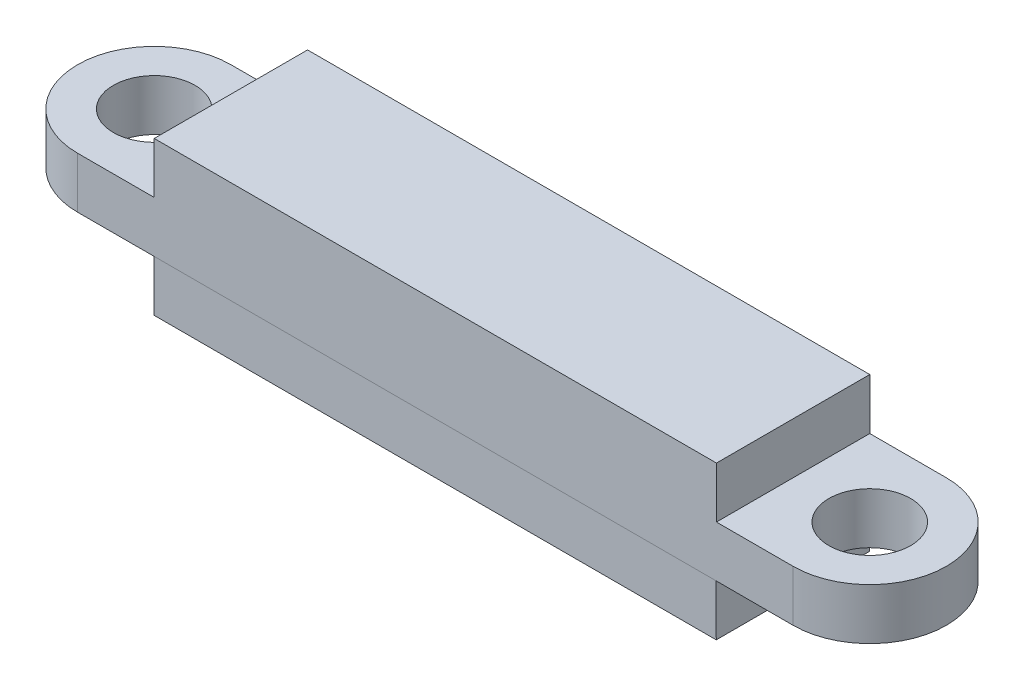
ISO-10303-21;
HEADER;
FILE_DESCRIPTION(('STEP AP214'),'2;1');
FILE_NAME('part.step','',(''),(''),'','','');
FILE_SCHEMA(('AUTOMOTIVE_DESIGN { 1 0 10303 214 1 1 1 1 }'));
ENDSEC;
DATA;
#1=APPLICATION_CONTEXT('core data for automotive mechanical design processes');
#2=APPLICATION_PROTOCOL_DEFINITION('international standard','automotive_design',2000,#1);
#3=PRODUCT_CONTEXT('',#1,'mechanical');
#4=PRODUCT('Part','Part','',(#3));
#5=PRODUCT_RELATED_PRODUCT_CATEGORY('part','',(#4));
#6=PRODUCT_DEFINITION_FORMATION('','',#4);
#7=PRODUCT_DEFINITION_CONTEXT('part definition',#1,'design');
#8=PRODUCT_DEFINITION('design','',#6,#7);
#9=PRODUCT_DEFINITION_SHAPE('','',#8);
#10=(LENGTH_UNIT() NAMED_UNIT(*) SI_UNIT(.MILLI.,.METRE.));
#11=(NAMED_UNIT(*) PLANE_ANGLE_UNIT() SI_UNIT($,.RADIAN.));
#12=(NAMED_UNIT(*) SI_UNIT($,.STERADIAN.) SOLID_ANGLE_UNIT());
#13=UNCERTAINTY_MEASURE_WITH_UNIT(LENGTH_MEASURE(1.E-05),#10,'distance_accuracy_value','');
#14=(GEOMETRIC_REPRESENTATION_CONTEXT(3) GLOBAL_UNCERTAINTY_ASSIGNED_CONTEXT((#13)) GLOBAL_UNIT_ASSIGNED_CONTEXT((#10,
#11,#12)) REPRESENTATION_CONTEXT('',''));
#15=CARTESIAN_POINT('',(0.,0.,0.));
#16=DIRECTION('',(0.,0.,1.));
#17=DIRECTION('',(1.,0.,0.));
#18=AXIS2_PLACEMENT_3D('',#15,#16,#17);
#19=CARTESIAN_POINT('',(35.,0.,0.));
#20=DIRECTION('',(0.,1.,0.));
#21=DIRECTION('',(0.,0.,1.));
#22=AXIS2_PLACEMENT_3D('',#19,#20,#21);
#23=PLANE('',#22);
#24=CARTESIAN_POINT('',(35.,0.,0.));
#25=DIRECTION('',(0.,1.,0.));
#26=DIRECTION('',(0.,0.,1.));
#27=AXIS2_PLACEMENT_3D('',#24,#25,#26);
#28=CIRCLE('',#27,4.);
#29=CARTESIAN_POINT('',(35.,0.,3.99999999999998));
#30=VERTEX_POINT('',#29);
#31=EDGE_CURVE('E330',#30,#30,#28,.T.);
#32=ORIENTED_EDGE('',*,*,#31,.T.);
#33=EDGE_LOOP('',(#32));
#34=FACE_BOUND('',#33,.T.);
#35=DIRECTION('',(0.,0.,1.));
#36=VECTOR('',#35,1.);
#37=CARTESIAN_POINT('',(27.4726856732423,0.,-7.50859596867283));
#38=LINE('',#37,#36);
#39=CARTESIAN_POINT('',(27.4726856732423,0.,-7.50404798433642));
#40=VERTEX_POINT('',#39);
#41=CARTESIAN_POINT('',(27.4726856732423,0.,7.49595201566357));
#42=VERTEX_POINT('',#41);
#43=EDGE_CURVE('E63',#40,#42,#38,.T.);
#44=ORIENTED_EDGE('',*,*,#43,.F.);
#45=DIRECTION('',(1.,0.,0.));
#46=VECTOR('',#45,1.);
#47=CARTESIAN_POINT('',(35.,0.,-7.50000000000001));
#48=LINE('',#47,#46);
#49=CARTESIAN_POINT('',(35.,0.,-7.50000000000001));
#50=VERTEX_POINT('',#49);
#51=EDGE_CURVE('E78',#50,#40,#48,.F.);
#52=ORIENTED_EDGE('',*,*,#51,.F.);
#53=CARTESIAN_POINT('',(35.,0.,0.));
#54=DIRECTION('',(0.,1.,0.));
#55=DIRECTION('',(0.,0.,1.));
#56=AXIS2_PLACEMENT_3D('',#53,#54,#55);
#57=CIRCLE('',#56,7.5);
#58=CARTESIAN_POINT('',(35.,0.,7.49999999999999));
#59=VERTEX_POINT('',#58);
#60=EDGE_CURVE('E246',#59,#50,#57,.T.);
#61=ORIENTED_EDGE('',*,*,#60,.F.);
#62=DIRECTION('',(-1.,0.,0.));
#63=VECTOR('',#62,1.);
#64=CARTESIAN_POINT('',(35.,0.,7.49999999999999));
#65=LINE('',#64,#63);
#66=EDGE_CURVE('E148',#42,#59,#65,.F.);
#67=ORIENTED_EDGE('',*,*,#66,.F.);
#68=EDGE_LOOP('',(#44,#52,#61,#67));
#69=FACE_BOUND('',#68,.T.);
#70=ADVANCED_FACE('F44',(#34,#69),#23,.F.);
#71=CARTESIAN_POINT('',(-35.,0.,0.));
#72=DIRECTION('',(0.,1.,0.));
#73=DIRECTION('',(0.,0.,1.));
#74=AXIS2_PLACEMENT_3D('',#71,#72,#73);
#75=CIRCLE('',#74,4.);
#76=CARTESIAN_POINT('',(-35.,0.,4.00000000000001));
#77=VERTEX_POINT('',#76);
#78=EDGE_CURVE('E331',#77,#77,#75,.T.);
#79=ORIENTED_EDGE('',*,*,#78,.T.);
#80=EDGE_LOOP('',(#79));
#81=FACE_BOUND('',#80,.T.);
#82=DIRECTION('',(0.,0.,-1.));
#83=VECTOR('',#82,1.);
#84=CARTESIAN_POINT('',(-27.5273143267578,0.,-7.50859596867283));
#85=LINE('',#84,#83);
#86=CARTESIAN_POINT('',(-27.5273143267578,0.,7.49595201566357));
#87=VERTEX_POINT('',#86);
#88=CARTESIAN_POINT('',(-27.5273143267578,0.,-7.50404798433641));
#89=VERTEX_POINT('',#88);
#90=EDGE_CURVE('E121',#87,#89,#85,.T.);
#91=ORIENTED_EDGE('',*,*,#90,.F.);
#92=DIRECTION('',(-1.,0.,0.));
#93=VECTOR('',#92,1.);
#94=CARTESIAN_POINT('',(35.,0.,7.49999999999999));
#95=LINE('',#94,#93);
#96=CARTESIAN_POINT('',(-35.,0.,7.50000000000001));
#97=VERTEX_POINT('',#96);
#98=EDGE_CURVE('E129',#97,#87,#95,.F.);
#99=ORIENTED_EDGE('',*,*,#98,.F.);
#100=CARTESIAN_POINT('',(-35.,0.,0.));
#101=DIRECTION('',(0.,1.,0.));
#102=DIRECTION('',(0.,0.,1.));
#103=AXIS2_PLACEMENT_3D('',#100,#101,#102);
#104=CIRCLE('',#103,7.5);
#105=CARTESIAN_POINT('',(-35.,0.,-7.49999999999999));
#106=VERTEX_POINT('',#105);
#107=EDGE_CURVE('E230',#106,#97,#104,.T.);
#108=ORIENTED_EDGE('',*,*,#107,.F.);
#109=DIRECTION('',(1.,0.,0.));
#110=VECTOR('',#109,1.);
#111=CARTESIAN_POINT('',(35.,0.,-7.50000000000001));
#112=LINE('',#111,#110);
#113=EDGE_CURVE('E128',#89,#106,#112,.F.);
#114=ORIENTED_EDGE('',*,*,#113,.F.);
#115=EDGE_LOOP('',(#91,#99,#108,#114));
#116=FACE_BOUND('',#115,.T.);
#117=ADVANCED_FACE('F127',(#81,#116),#23,.F.);
#118=CARTESIAN_POINT('',(35.,5.,0.));
#119=DIRECTION('',(0.,1.,0.));
#120=DIRECTION('',(0.,0.,1.));
#121=AXIS2_PLACEMENT_3D('',#118,#119,#120);
#122=PLANE('',#121);
#123=DIRECTION('',(0.,0.,-1.));
#124=VECTOR('',#123,1.);
#125=CARTESIAN_POINT('',(27.5,5.,7.50000000000008));
#126=LINE('',#125,#124);
#127=CARTESIAN_POINT('',(27.5,5.,7.49999999999999));
#128=VERTEX_POINT('',#127);
#129=CARTESIAN_POINT('',(27.5,5.,-7.50000000000001));
#130=VERTEX_POINT('',#129);
#131=EDGE_CURVE('E298',#128,#130,#126,.T.);
#132=ORIENTED_EDGE('',*,*,#131,.F.);
#133=DIRECTION('',(1.,0.,0.));
#134=VECTOR('',#133,1.);
#135=CARTESIAN_POINT('',(35.,5.,7.49999999999999));
#136=LINE('',#135,#134);
#137=CARTESIAN_POINT('',(35.,5.,7.49999999999999));
#138=VERTEX_POINT('',#137);
#139=EDGE_CURVE('E354',#128,#138,#136,.T.);
#140=ORIENTED_EDGE('',*,*,#139,.T.);
#141=CARTESIAN_POINT('',(35.,5.,0.));
#142=DIRECTION('',(0.,1.,0.));
#143=DIRECTION('',(0.,0.,1.));
#144=AXIS2_PLACEMENT_3D('',#141,#142,#143);
#145=CIRCLE('',#144,7.5);
#146=CARTESIAN_POINT('',(35.,5.,-7.50000000000001));
#147=VERTEX_POINT('',#146);
#148=EDGE_CURVE('E146',#138,#147,#145,.T.);
#149=ORIENTED_EDGE('',*,*,#148,.T.);
#150=DIRECTION('',(-1.,0.,0.));
#151=VECTOR('',#150,1.);
#152=CARTESIAN_POINT('',(35.,5.,-7.50000000000001));
#153=LINE('',#152,#151);
#154=EDGE_CURVE('E350',#147,#130,#153,.T.);
#155=ORIENTED_EDGE('',*,*,#154,.T.);
#156=EDGE_LOOP('',(#132,#140,#149,#155));
#157=FACE_BOUND('',#156,.T.);
#158=CARTESIAN_POINT('',(35.,5.,0.));
#159=DIRECTION('',(0.,1.,0.));
#160=DIRECTION('',(0.,0.,1.));
#161=AXIS2_PLACEMENT_3D('',#158,#159,#160);
#162=CIRCLE('',#161,4.);
#163=CARTESIAN_POINT('',(35.,5.,3.99999999999998));
#164=VERTEX_POINT('',#163);
#165=EDGE_CURVE('E328',#164,#164,#162,.T.);
#166=ORIENTED_EDGE('',*,*,#165,.F.);
#167=EDGE_LOOP('',(#166));
#168=FACE_BOUND('',#167,.T.);
#169=ADVANCED_FACE('F214',(#157,#168),#122,.T.);
#170=DIRECTION('',(0.,0.,1.));
#171=VECTOR('',#170,1.);
#172=CARTESIAN_POINT('',(-27.5,5.,7.49999999999994));
#173=LINE('',#172,#171);
#174=CARTESIAN_POINT('',(-27.5,5.,-7.49999999999999));
#175=VERTEX_POINT('',#174);
#176=CARTESIAN_POINT('',(-27.5,5.,7.49999999999994));
#177=VERTEX_POINT('',#176);
#178=EDGE_CURVE('E161',#175,#177,#173,.T.);
#179=ORIENTED_EDGE('',*,*,#178,.F.);
#180=CARTESIAN_POINT('',(-35.,5.,-7.49999999999999));
#181=VERTEX_POINT('',#180);
#182=EDGE_CURVE('E346',#175,#181,#153,.T.);
#183=ORIENTED_EDGE('',*,*,#182,.T.);
#184=CARTESIAN_POINT('',(-35.,5.,0.));
#185=DIRECTION('',(0.,1.,0.));
#186=DIRECTION('',(0.,0.,1.));
#187=AXIS2_PLACEMENT_3D('',#184,#185,#186);
#188=CIRCLE('',#187,7.5);
#189=CARTESIAN_POINT('',(-35.,5.,7.50000000000001));
#190=VERTEX_POINT('',#189);
#191=EDGE_CURVE('E347',#181,#190,#188,.T.);
#192=ORIENTED_EDGE('',*,*,#191,.T.);
#193=EDGE_CURVE('E227',#190,#177,#136,.T.);
#194=ORIENTED_EDGE('',*,*,#193,.T.);
#195=EDGE_LOOP('',(#179,#183,#192,#194));
#196=FACE_BOUND('',#195,.T.);
#197=CARTESIAN_POINT('',(-35.,5.,0.));
#198=DIRECTION('',(0.,1.,0.));
#199=DIRECTION('',(0.,0.,1.));
#200=AXIS2_PLACEMENT_3D('',#197,#198,#199);
#201=CIRCLE('',#200,4.);
#202=CARTESIAN_POINT('',(-35.,5.,4.00000000000001));
#203=VERTEX_POINT('',#202);
#204=EDGE_CURVE('E337',#203,#203,#201,.T.);
#205=ORIENTED_EDGE('',*,*,#204,.F.);
#206=EDGE_LOOP('',(#205));
#207=FACE_BOUND('',#206,.T.);
#208=ADVANCED_FACE('F208',(#196,#207),#122,.T.);
#209=CARTESIAN_POINT('',(35.,5.,0.));
#210=DIRECTION('',(0.,-1.,0.));
#211=DIRECTION('',(0.,0.,-1.));
#212=AXIS2_PLACEMENT_3D('',#209,#210,#211);
#213=CYLINDRICAL_SURFACE('',#212,7.5);
#214=ORIENTED_EDGE('',*,*,#60,.T.);
#215=DIRECTION('',(0.,-1.,0.));
#216=VECTOR('',#215,1.);
#217=CARTESIAN_POINT('',(35.,5.,-7.50000000000001));
#218=LINE('',#217,#216);
#219=EDGE_CURVE('E11',#147,#50,#218,.T.);
#220=ORIENTED_EDGE('',*,*,#219,.F.);
#221=ORIENTED_EDGE('',*,*,#148,.F.);
#222=DIRECTION('',(0.,-1.,0.));
#223=VECTOR('',#222,1.);
#224=CARTESIAN_POINT('',(35.,5.,7.49999999999999));
#225=LINE('',#224,#223);
#226=EDGE_CURVE('E356',#138,#59,#225,.T.);
#227=ORIENTED_EDGE('',*,*,#226,.T.);
#228=EDGE_LOOP('',(#214,#220,#221,#227));
#229=FACE_BOUND('',#228,.T.);
#230=ADVANCED_FACE('F50',(#229),#213,.T.);
#231=CARTESIAN_POINT('',(35.,5.,-7.50000000000001));
#232=DIRECTION('',(0.,0.,1.));
#233=DIRECTION('',(1.,0.,0.));
#234=AXIS2_PLACEMENT_3D('',#231,#232,#233);
#235=PLANE('',#234);
#236=ORIENTED_EDGE('',*,*,#51,.T.);
#237=CARTESIAN_POINT('',(-27.5273143267578,0.,-7.50859596867283));
#238=DIRECTION('',(1.,0.,0.));
#239=VECTOR('',#238,1.);
#240=LINE('',#237,#239);
#241=EDGE_CURVE('E139',#89,#40,#240,.T.);
#242=ORIENTED_EDGE('',*,*,#241,.F.);
#243=ORIENTED_EDGE('',*,*,#113,.T.);
#244=DIRECTION('',(0.,-1.,0.));
#245=VECTOR('',#244,1.);
#246=CARTESIAN_POINT('',(-35.,5.,-7.49999999999999));
#247=LINE('',#246,#245);
#248=EDGE_CURVE('E57',#181,#106,#247,.T.);
#249=ORIENTED_EDGE('',*,*,#248,.F.);
#250=ORIENTED_EDGE('',*,*,#182,.F.);
#251=DIRECTION('',(0.,-1.,0.));
#252=VECTOR('',#251,1.);
#253=CARTESIAN_POINT('',(-27.5,10.,-7.49999999999999));
#254=LINE('',#253,#252);
#255=CARTESIAN_POINT('',(-27.5,10.,-7.49999999999999));
#256=VERTEX_POINT('',#255);
#257=EDGE_CURVE('E324',#256,#175,#254,.T.);
#258=ORIENTED_EDGE('',*,*,#257,.F.);
#259=DIRECTION('',(-1.,0.,0.));
#260=VECTOR('',#259,1.);
#261=CARTESIAN_POINT('',(-27.5,10.,-7.49999999999999));
#262=LINE('',#261,#260);
#263=CARTESIAN_POINT('',(27.5,10.,-7.50000000000001));
#264=VERTEX_POINT('',#263);
#265=EDGE_CURVE('E292',#264,#256,#262,.T.);
#266=ORIENTED_EDGE('',*,*,#265,.F.);
#267=DIRECTION('',(0.,-1.,0.));
#268=VECTOR('',#267,1.);
#269=CARTESIAN_POINT('',(27.5,10.,-7.50000000000001));
#270=LINE('',#269,#268);
#271=EDGE_CURVE('E304',#264,#130,#270,.T.);
#272=ORIENTED_EDGE('',*,*,#271,.T.);
#273=ORIENTED_EDGE('',*,*,#154,.F.);
#274=ORIENTED_EDGE('',*,*,#219,.T.);
#275=EDGE_LOOP('',(#236,#242,#243,#249,#250,#258,#266,#272,#273,#274));
#276=FACE_BOUND('',#275,.T.);
#277=ADVANCED_FACE('F247',(#276),#235,.F.);
#278=CARTESIAN_POINT('',(-35.,5.,0.));
#279=DIRECTION('',(0.,-1.,0.));
#280=DIRECTION('',(0.,0.,-1.));
#281=AXIS2_PLACEMENT_3D('',#278,#279,#280);
#282=CYLINDRICAL_SURFACE('',#281,7.5);
#283=ORIENTED_EDGE('',*,*,#107,.T.);
#284=DIRECTION('',(0.,-1.,0.));
#285=VECTOR('',#284,1.);
#286=CARTESIAN_POINT('',(-35.,5.,7.50000000000001));
#287=LINE('',#286,#285);
#288=EDGE_CURVE('E150',#190,#97,#287,.T.);
#289=ORIENTED_EDGE('',*,*,#288,.F.);
#290=ORIENTED_EDGE('',*,*,#191,.F.);
#291=ORIENTED_EDGE('',*,*,#248,.T.);
#292=EDGE_LOOP('',(#283,#289,#290,#291));
#293=FACE_BOUND('',#292,.T.);
#294=ADVANCED_FACE('F224',(#293),#282,.T.);
#295=CARTESIAN_POINT('',(35.,5.,7.49999999999999));
#296=DIRECTION('',(0.,0.,-1.));
#297=DIRECTION('',(-1.,0.,0.));
#298=AXIS2_PLACEMENT_3D('',#295,#296,#297);
#299=PLANE('',#298);
#300=ORIENTED_EDGE('',*,*,#98,.T.);
#301=CARTESIAN_POINT('',(27.4726856732423,0.,7.49140403132714));
#302=DIRECTION('',(-1.,0.,0.));
#303=VECTOR('',#302,1.);
#304=LINE('',#301,#303);
#305=EDGE_CURVE('E136',#42,#87,#304,.T.);
#306=ORIENTED_EDGE('',*,*,#305,.F.);
#307=ORIENTED_EDGE('',*,*,#66,.T.);
#308=ORIENTED_EDGE('',*,*,#226,.F.);
#309=ORIENTED_EDGE('',*,*,#139,.F.);
#310=DIRECTION('',(0.,-1.,0.));
#311=VECTOR('',#310,1.);
#312=CARTESIAN_POINT('',(27.5,10.,7.50000000000008));
#313=LINE('',#312,#311);
#314=CARTESIAN_POINT('',(27.5,10.,7.50000000000008));
#315=VERTEX_POINT('',#314);
#316=EDGE_CURVE('E314',#315,#128,#313,.T.);
#317=ORIENTED_EDGE('',*,*,#316,.F.);
#318=DIRECTION('',(1.,0.,0.));
#319=VECTOR('',#318,1.);
#320=CARTESIAN_POINT('',(-27.5,10.,7.49999999999994));
#321=LINE('',#320,#319);
#322=CARTESIAN_POINT('',(-27.5,10.,7.49999999999994));
#323=VERTEX_POINT('',#322);
#324=EDGE_CURVE('E297',#323,#315,#321,.T.);
#325=ORIENTED_EDGE('',*,*,#324,.F.);
#326=DIRECTION('',(0.,-1.,0.));
#327=VECTOR('',#326,1.);
#328=CARTESIAN_POINT('',(-27.5,10.,7.49999999999994));
#329=LINE('',#328,#327);
#330=EDGE_CURVE('E316',#323,#177,#329,.T.);
#331=ORIENTED_EDGE('',*,*,#330,.T.);
#332=ORIENTED_EDGE('',*,*,#193,.F.);
#333=ORIENTED_EDGE('',*,*,#288,.T.);
#334=EDGE_LOOP('',(#300,#306,#307,#308,#309,#317,#325,#331,#332,#333));
#335=FACE_BOUND('',#334,.T.);
#336=ADVANCED_FACE('F145',(#335),#299,.F.);
#337=CARTESIAN_POINT('',(-35.,5.,0.));
#338=DIRECTION('',(0.,-1.,0.));
#339=DIRECTION('',(0.,0.,-1.));
#340=AXIS2_PLACEMENT_3D('',#337,#338,#339);
#341=CYLINDRICAL_SURFACE('',#340,4.);
#342=ORIENTED_EDGE('',*,*,#204,.T.);
#343=EDGE_LOOP('',(#342));
#344=FACE_BOUND('',#343,.T.);
#345=ORIENTED_EDGE('',*,*,#78,.F.);
#346=EDGE_LOOP('',(#345));
#347=FACE_BOUND('',#346,.T.);
#348=ADVANCED_FACE('F202',(#344,#347),#341,.F.);
#349=CARTESIAN_POINT('',(35.,5.,0.));
#350=DIRECTION('',(0.,-1.,0.));
#351=DIRECTION('',(0.,0.,-1.));
#352=AXIS2_PLACEMENT_3D('',#349,#350,#351);
#353=CYLINDRICAL_SURFACE('',#352,4.);
#354=ORIENTED_EDGE('',*,*,#165,.T.);
#355=EDGE_LOOP('',(#354));
#356=FACE_BOUND('',#355,.T.);
#357=ORIENTED_EDGE('',*,*,#31,.F.);
#358=EDGE_LOOP('',(#357));
#359=FACE_BOUND('',#358,.T.);
#360=ADVANCED_FACE('F204',(#356,#359),#353,.F.);
#361=CARTESIAN_POINT('',(-27.5,10.,7.49999999999994));
#362=DIRECTION('',(1.,0.,0.));
#363=DIRECTION('',(0.,0.,-1.));
#364=AXIS2_PLACEMENT_3D('',#361,#362,#363);
#365=PLANE('',#364);
#366=ORIENTED_EDGE('',*,*,#178,.T.);
#367=ORIENTED_EDGE('',*,*,#330,.F.);
#368=DIRECTION('',(0.,0.,1.));
#369=VECTOR('',#368,1.);
#370=CARTESIAN_POINT('',(-27.5,10.,7.49999999999994));
#371=LINE('',#370,#369);
#372=EDGE_CURVE('E294',#256,#323,#371,.T.);
#373=ORIENTED_EDGE('',*,*,#372,.F.);
#374=ORIENTED_EDGE('',*,*,#257,.T.);
#375=EDGE_LOOP('',(#366,#367,#373,#374));
#376=FACE_BOUND('',#375,.T.);
#377=ADVANCED_FACE('F200',(#376),#365,.F.);
#378=CARTESIAN_POINT('',(27.5,10.,7.50000000000008));
#379=DIRECTION('',(-1.,0.,0.));
#380=DIRECTION('',(0.,0.,1.));
#381=AXIS2_PLACEMENT_3D('',#378,#379,#380);
#382=PLANE('',#381);
#383=ORIENTED_EDGE('',*,*,#131,.T.);
#384=ORIENTED_EDGE('',*,*,#271,.F.);
#385=DIRECTION('',(0.,0.,-1.));
#386=VECTOR('',#385,1.);
#387=CARTESIAN_POINT('',(27.5,10.,7.50000000000008));
#388=LINE('',#387,#386);
#389=EDGE_CURVE('E87',#315,#264,#388,.T.);
#390=ORIENTED_EDGE('',*,*,#389,.F.);
#391=ORIENTED_EDGE('',*,*,#316,.T.);
#392=EDGE_LOOP('',(#383,#384,#390,#391));
#393=FACE_BOUND('',#392,.T.);
#394=ADVANCED_FACE('F191',(#393),#382,.F.);
#395=CARTESIAN_POINT('',(0.,10.,0.));
#396=DIRECTION('',(0.,1.,0.));
#397=DIRECTION('',(0.,0.,1.));
#398=AXIS2_PLACEMENT_3D('',#395,#396,#397);
#399=PLANE('',#398);
#400=ORIENTED_EDGE('',*,*,#265,.T.);
#401=ORIENTED_EDGE('',*,*,#372,.T.);
#402=ORIENTED_EDGE('',*,*,#324,.T.);
#403=ORIENTED_EDGE('',*,*,#389,.T.);
#404=EDGE_LOOP('',(#400,#401,#402,#403));
#405=FACE_BOUND('',#404,.T.);
#406=ADVANCED_FACE('F188',(#405),#399,.T.);
#407=CARTESIAN_POINT('',(-27.5273143267578,-5.,7.49140403132714));
#408=DIRECTION('',(0.,0.,-1.));
#409=DIRECTION('',(-1.,0.,0.));
#410=AXIS2_PLACEMENT_3D('',#407,#408,#409);
#411=PLANE('',#410);
#412=ORIENTED_EDGE('',*,*,#305,.T.);
#413=DIRECTION('',(0.,1.,0.));
#414=VECTOR('',#413,1.);
#415=CARTESIAN_POINT('',(-27.5273143267578,-5.,7.49140403132714));
#416=LINE('',#415,#414);
#417=CARTESIAN_POINT('',(-27.5273143267578,-5.,7.49140403132714));
#418=VERTEX_POINT('',#417);
#419=EDGE_CURVE('E152',#418,#87,#416,.T.);
#420=ORIENTED_EDGE('',*,*,#419,.F.);
#421=DIRECTION('',(-1.,0.,0.));
#422=VECTOR('',#421,1.);
#423=CARTESIAN_POINT('',(-27.5273143267578,-5.,7.49140403132714));
#424=LINE('',#423,#422);
#425=CARTESIAN_POINT('',(27.4726856732423,-5.,7.49140403132714));
#426=VERTEX_POINT('',#425);
#427=EDGE_CURVE('E392',#426,#418,#424,.T.);
#428=ORIENTED_EDGE('',*,*,#427,.F.);
#429=DIRECTION('',(0.,1.,0.));
#430=VECTOR('',#429,1.);
#431=CARTESIAN_POINT('',(27.4726856732423,-5.,7.49140403132714));
#432=LINE('',#431,#430);
#433=EDGE_CURVE('E167',#426,#42,#432,.T.);
#434=ORIENTED_EDGE('',*,*,#433,.T.);
#435=EDGE_LOOP('',(#412,#420,#428,#434));
#436=FACE_BOUND('',#435,.T.);
#437=ADVANCED_FACE('F166',(#436),#411,.F.);
#438=CARTESIAN_POINT('',(-27.5273143267578,-5.,-7.50859596867283));
#439=DIRECTION('',(1.,0.,0.));
#440=DIRECTION('',(0.,0.,-1.));
#441=AXIS2_PLACEMENT_3D('',#438,#439,#440);
#442=PLANE('',#441);
#443=ORIENTED_EDGE('',*,*,#90,.T.);
#444=DIRECTION('',(0.,1.,0.));
#445=VECTOR('',#444,1.);
#446=CARTESIAN_POINT('',(-27.5273143267578,-5.,-7.50859596867283));
#447=LINE('',#446,#445);
#448=CARTESIAN_POINT('',(-27.5273143267578,-5.,-7.50859596867283));
#449=VERTEX_POINT('',#448);
#450=EDGE_CURVE('E165',#449,#89,#447,.T.);
#451=ORIENTED_EDGE('',*,*,#450,.F.);
#452=DIRECTION('',(0.,0.,-1.));
#453=VECTOR('',#452,1.);
#454=CARTESIAN_POINT('',(-27.5273143267578,-5.,-7.50859596867283));
#455=LINE('',#454,#453);
#456=EDGE_CURVE('E160',#418,#449,#455,.T.);
#457=ORIENTED_EDGE('',*,*,#456,.F.);
#458=ORIENTED_EDGE('',*,*,#419,.T.);
#459=EDGE_LOOP('',(#443,#451,#457,#458));
#460=FACE_BOUND('',#459,.T.);
#461=ADVANCED_FACE('F154',(#460),#442,.F.);
#462=CARTESIAN_POINT('',(-27.5273143267578,-5.,-7.50859596867283));
#463=DIRECTION('',(0.,0.,1.));
#464=DIRECTION('',(1.,0.,0.));
#465=AXIS2_PLACEMENT_3D('',#462,#463,#464);
#466=PLANE('',#465);
#467=ORIENTED_EDGE('',*,*,#241,.T.);
#468=DIRECTION('',(0.,1.,0.));
#469=VECTOR('',#468,1.);
#470=CARTESIAN_POINT('',(27.4726856732423,-5.,-7.50859596867283));
#471=LINE('',#470,#469);
#472=CARTESIAN_POINT('',(27.4726856732423,-5.,-7.50859596867283));
#473=VERTEX_POINT('',#472);
#474=EDGE_CURVE('E271',#473,#40,#471,.T.);
#475=ORIENTED_EDGE('',*,*,#474,.F.);
#476=DIRECTION('',(1.,0.,0.));
#477=VECTOR('',#476,1.);
#478=CARTESIAN_POINT('',(-27.5273143267578,-5.,-7.50859596867283));
#479=LINE('',#478,#477);
#480=EDGE_CURVE('E393',#449,#473,#479,.T.);
#481=ORIENTED_EDGE('',*,*,#480,.F.);
#482=ORIENTED_EDGE('',*,*,#450,.T.);
#483=EDGE_LOOP('',(#467,#475,#481,#482));
#484=FACE_BOUND('',#483,.T.);
#485=ADVANCED_FACE('F267',(#484),#466,.F.);
#486=CARTESIAN_POINT('',(27.4726856732423,-5.,-7.50859596867283));
#487=DIRECTION('',(-1.,0.,0.));
#488=DIRECTION('',(0.,0.,1.));
#489=AXIS2_PLACEMENT_3D('',#486,#487,#488);
#490=PLANE('',#489);
#491=ORIENTED_EDGE('',*,*,#43,.T.);
#492=ORIENTED_EDGE('',*,*,#433,.F.);
#493=DIRECTION('',(0.,0.,1.));
#494=VECTOR('',#493,1.);
#495=CARTESIAN_POINT('',(27.4726856732423,-5.,-7.50859596867283));
#496=LINE('',#495,#494);
#497=EDGE_CURVE('E172',#473,#426,#496,.T.);
#498=ORIENTED_EDGE('',*,*,#497,.F.);
#499=ORIENTED_EDGE('',*,*,#474,.T.);
#500=EDGE_LOOP('',(#491,#492,#498,#499));
#501=FACE_BOUND('',#500,.T.);
#502=ADVANCED_FACE('F276',(#501),#490,.F.);
#503=CARTESIAN_POINT('',(0.,-5.,0.));
#504=DIRECTION('',(0.,-1.,0.));
#505=DIRECTION('',(0.,0.,-1.));
#506=AXIS2_PLACEMENT_3D('',#503,#504,#505);
#507=PLANE('',#506);
#508=ORIENTED_EDGE('',*,*,#427,.T.);
#509=ORIENTED_EDGE('',*,*,#456,.T.);
#510=ORIENTED_EDGE('',*,*,#480,.T.);
#511=ORIENTED_EDGE('',*,*,#497,.T.);
#512=EDGE_LOOP('',(#508,#509,#510,#511));
#513=FACE_BOUND('',#512,.T.);
#514=ADVANCED_FACE('F395',(#513),#507,.T.);
#515=CLOSED_SHELL('',(#70,#117,#169,#208,#230,#277,#294,#336,#348,#360,#377,#394,#406,#437,#461,
#485,#502,#514));
#516=MANIFOLD_SOLID_BREP('B2',#515);
#517=ADVANCED_BREP_SHAPE_REPRESENTATION('',(#18,#516),#14);
#518=SHAPE_DEFINITION_REPRESENTATION(#9,#517);
ENDSEC;
END-ISO-10303-21;
